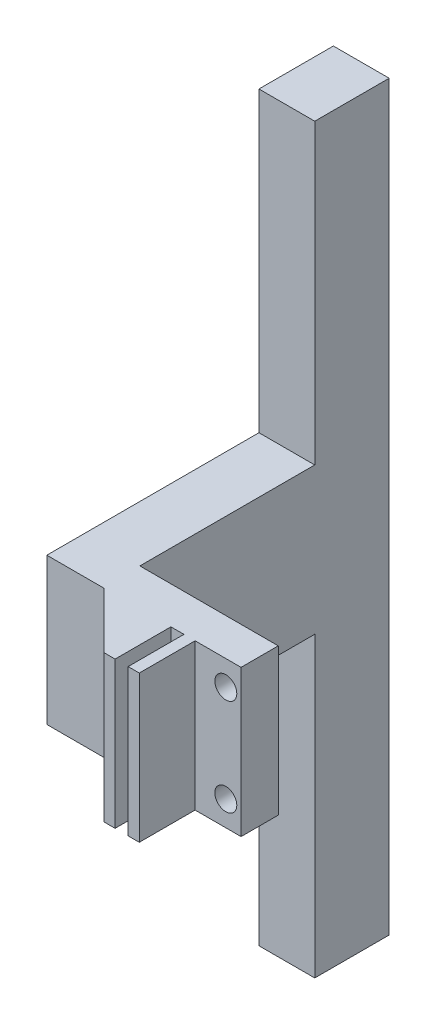
ISO-10303-21;
HEADER;
FILE_DESCRIPTION(('STEP AP214'),'2;1');
FILE_NAME('part.step','',(''),(''),'','','');
FILE_SCHEMA(('AUTOMOTIVE_DESIGN { 1 0 10303 214 1 1 1 1 }'));
ENDSEC;
DATA;
#1=APPLICATION_CONTEXT('core data for automotive mechanical design processes');
#2=APPLICATION_PROTOCOL_DEFINITION('international standard','automotive_design',2000,#1);
#3=PRODUCT_CONTEXT('',#1,'mechanical');
#4=PRODUCT('Part','Part','',(#3));
#5=PRODUCT_RELATED_PRODUCT_CATEGORY('part','',(#4));
#6=PRODUCT_DEFINITION_FORMATION('','',#4);
#7=PRODUCT_DEFINITION_CONTEXT('part definition',#1,'design');
#8=PRODUCT_DEFINITION('design','',#6,#7);
#9=PRODUCT_DEFINITION_SHAPE('','',#8);
#10=(LENGTH_UNIT() NAMED_UNIT(*) SI_UNIT(.MILLI.,.METRE.));
#11=(NAMED_UNIT(*) PLANE_ANGLE_UNIT() SI_UNIT($,.RADIAN.));
#12=(NAMED_UNIT(*) SI_UNIT($,.STERADIAN.) SOLID_ANGLE_UNIT());
#13=UNCERTAINTY_MEASURE_WITH_UNIT(LENGTH_MEASURE(1.E-05),#10,'distance_accuracy_value','');
#14=(GEOMETRIC_REPRESENTATION_CONTEXT(3) GLOBAL_UNCERTAINTY_ASSIGNED_CONTEXT((#13)) GLOBAL_UNIT_ASSIGNED_CONTEXT((#10,
#11,#12)) REPRESENTATION_CONTEXT('',''));
#15=CARTESIAN_POINT('',(0.,0.,0.));
#16=DIRECTION('',(0.,0.,1.));
#17=DIRECTION('',(1.,0.,0.));
#18=AXIS2_PLACEMENT_3D('',#15,#16,#17);
#19=CARTESIAN_POINT('',(0.,0.,10.));
#20=DIRECTION('',(0.,0.,1.));
#21=DIRECTION('',(1.,0.,0.));
#22=AXIS2_PLACEMENT_3D('',#19,#20,#21);
#23=PLANE('',#22);
#24=DIRECTION('',(1.,0.,0.));
#25=VECTOR('',#24,1.);
#26=CARTESIAN_POINT('',(0.,0.,10.));
#27=LINE('',#26,#25);
#28=CARTESIAN_POINT('',(-1.75000379152257,0.,10.));
#29=VERTEX_POINT('',#28);
#30=CARTESIAN_POINT('',(1.74999620847744,0.,10.));
#31=VERTEX_POINT('',#30);
#32=EDGE_CURVE('E297',#29,#31,#27,.T.);
#33=ORIENTED_EDGE('',*,*,#32,.F.);
#34=DIRECTION('',(0.,1.,0.));
#35=VECTOR('',#34,1.);
#36=CARTESIAN_POINT('',(-1.75000379152257,-39.4,10.));
#37=LINE('',#36,#35);
#38=CARTESIAN_POINT('',(-1.75000379152257,-39.4,10.));
#39=VERTEX_POINT('',#38);
#40=EDGE_CURVE('E233',#39,#29,#37,.T.);
#41=ORIENTED_EDGE('',*,*,#40,.F.);
#42=DIRECTION('',(-1.,0.,0.));
#43=VECTOR('',#42,1.);
#44=CARTESIAN_POINT('',(0.,-39.4,10.));
#45=LINE('',#44,#43);
#46=CARTESIAN_POINT('',(1.74999620847744,-39.4,10.));
#47=VERTEX_POINT('',#46);
#48=EDGE_CURVE('E290',#47,#39,#45,.T.);
#49=ORIENTED_EDGE('',*,*,#48,.F.);
#50=DIRECTION('',(0.,-1.,0.));
#51=VECTOR('',#50,1.);
#52=CARTESIAN_POINT('',(1.74999620847743,0.,10.));
#53=LINE('',#52,#51);
#54=EDGE_CURVE('E256',#31,#47,#53,.T.);
#55=ORIENTED_EDGE('',*,*,#54,.F.);
#56=EDGE_LOOP('',(#33,#41,#49,#55));
#57=FACE_BOUND('',#56,.T.);
#58=ADVANCED_FACE('F36',(#57),#23,.T.);
#59=CARTESIAN_POINT('',(-19.7500037915225,-39.4,10.));
#60=VERTEX_POINT('',#59);
#61=CARTESIAN_POINT('',(-35.098203500428,-39.4,10.));
#62=VERTEX_POINT('',#61);
#63=EDGE_CURVE('E285',#60,#62,#45,.T.);
#64=ORIENTED_EDGE('',*,*,#63,.F.);
#65=DIRECTION('',(0.,1.,0.));
#66=VECTOR('',#65,1.);
#67=CARTESIAN_POINT('',(-19.7500037915225,0.,10.));
#68=LINE('',#67,#66);
#69=CARTESIAN_POINT('',(-19.7500037915225,0.,10.));
#70=VERTEX_POINT('',#69);
#71=EDGE_CURVE('E54',#60,#70,#68,.T.);
#72=ORIENTED_EDGE('',*,*,#71,.T.);
#73=CARTESIAN_POINT('',(-35.098203500428,0.,10.));
#74=VERTEX_POINT('',#73);
#75=EDGE_CURVE('E294',#74,#70,#27,.T.);
#76=ORIENTED_EDGE('',*,*,#75,.F.);
#77=DIRECTION('',(0.,-1.,0.));
#78=VECTOR('',#77,1.);
#79=CARTESIAN_POINT('',(-35.098203500428,-39.4,10.));
#80=LINE('',#79,#78);
#81=EDGE_CURVE('E218',#74,#62,#80,.T.);
#82=ORIENTED_EDGE('',*,*,#81,.T.);
#83=EDGE_LOOP('',(#64,#72,#76,#82));
#84=FACE_BOUND('',#83,.T.);
#85=ADVANCED_FACE('F342',(#84),#23,.T.);
#86=CARTESIAN_POINT('',(0.,-39.4,10.));
#87=DIRECTION('',(0.,-1.,0.));
#88=DIRECTION('',(0.,0.,-1.));
#89=AXIS2_PLACEMENT_3D('',#86,#87,#88);
#90=PLANE('',#89);
#91=DIRECTION('',(-1.,0.,0.));
#92=VECTOR('',#91,1.);
#93=CARTESIAN_POINT('',(-35.098203500428,-39.4,-47.));
#94=LINE('',#93,#92);
#95=CARTESIAN_POINT('',(-20.098203500428,-39.4,-47.));
#96=VERTEX_POINT('',#95);
#97=CARTESIAN_POINT('',(-35.098203500428,-39.4,-47.));
#98=VERTEX_POINT('',#97);
#99=EDGE_CURVE('E189',#96,#98,#94,.T.);
#100=ORIENTED_EDGE('',*,*,#99,.F.);
#101=DIRECTION('',(0.,0.,1.));
#102=VECTOR('',#101,1.);
#103=CARTESIAN_POINT('',(-20.098203500428,-39.4,-67.));
#104=LINE('',#103,#102);
#105=CARTESIAN_POINT('',(-20.098203500428,-39.4,0.));
#106=VERTEX_POINT('',#105);
#107=EDGE_CURVE('E222',#96,#106,#104,.T.);
#108=ORIENTED_EDGE('',*,*,#107,.T.);
#109=DIRECTION('',(-1.,0.,0.));
#110=VECTOR('',#109,1.);
#111=CARTESIAN_POINT('',(0.,-39.4,0.));
#112=LINE('',#111,#110);
#113=CARTESIAN_POINT('',(17.0981959173828,-39.4,0.));
#114=VERTEX_POINT('',#113);
#115=EDGE_CURVE('E309',#114,#106,#112,.T.);
#116=ORIENTED_EDGE('',*,*,#115,.F.);
#117=DIRECTION('',(0.,0.,-1.));
#118=VECTOR('',#117,1.);
#119=CARTESIAN_POINT('',(17.0981959173828,-39.4,10.));
#120=LINE('',#119,#118);
#121=CARTESIAN_POINT('',(17.0981959173828,-39.4,10.));
#122=VERTEX_POINT('',#121);
#123=EDGE_CURVE('E320',#122,#114,#120,.T.);
#124=ORIENTED_EDGE('',*,*,#123,.F.);
#125=CARTESIAN_POINT('',(4.74999620847743,-39.4,10.));
#126=VERTEX_POINT('',#125);
#127=EDGE_CURVE('E286',#122,#126,#45,.T.);
#128=ORIENTED_EDGE('',*,*,#127,.T.);
#129=DIRECTION('',(0.,0.,-1.));
#130=VECTOR('',#129,1.);
#131=CARTESIAN_POINT('',(4.74999620847743,-39.4,25.));
#132=LINE('',#131,#130);
#133=CARTESIAN_POINT('',(4.74999620847743,-39.4,25.));
#134=VERTEX_POINT('',#133);
#135=EDGE_CURVE('E275',#134,#126,#132,.T.);
#136=ORIENTED_EDGE('',*,*,#135,.F.);
#137=DIRECTION('',(1.,0.,0.));
#138=VECTOR('',#137,1.);
#139=CARTESIAN_POINT('',(4.74999620847743,-39.4,25.));
#140=LINE('',#139,#138);
#141=CARTESIAN_POINT('',(1.74999620847744,-39.4,25.));
#142=VERTEX_POINT('',#141);
#143=EDGE_CURVE('E252',#142,#134,#140,.T.);
#144=ORIENTED_EDGE('',*,*,#143,.F.);
#145=DIRECTION('',(0.,0.,-1.));
#146=VECTOR('',#145,1.);
#147=CARTESIAN_POINT('',(1.74999620847744,-39.4,25.));
#148=LINE('',#147,#146);
#149=EDGE_CURVE('E262',#142,#47,#148,.T.);
#150=ORIENTED_EDGE('',*,*,#149,.T.);
#151=ORIENTED_EDGE('',*,*,#48,.T.);
#152=DIRECTION('',(0.,0.,-1.));
#153=VECTOR('',#152,1.);
#154=CARTESIAN_POINT('',(-1.75000379152257,-39.4,25.));
#155=LINE('',#154,#153);
#156=CARTESIAN_POINT('',(-1.75000379152257,-39.4,25.));
#157=VERTEX_POINT('',#156);
#158=EDGE_CURVE('E249',#157,#39,#155,.T.);
#159=ORIENTED_EDGE('',*,*,#158,.F.);
#160=DIRECTION('',(1.,0.,0.));
#161=VECTOR('',#160,1.);
#162=CARTESIAN_POINT('',(-1.75000379152257,-39.4,25.));
#163=LINE('',#162,#161);
#164=CARTESIAN_POINT('',(-4.75000379152257,-39.4,25.));
#165=VERTEX_POINT('',#164);
#166=EDGE_CURVE('E234',#165,#157,#163,.T.);
#167=ORIENTED_EDGE('',*,*,#166,.F.);
#168=DIRECTION('',(-0.707106781186546,0.,-0.707106781186549));
#169=VECTOR('',#168,1.);
#170=CARTESIAN_POINT('',(-4.75000379152257,-39.4,25.));
#171=LINE('',#170,#169);
#172=EDGE_CURVE('E46',#165,#60,#171,.T.);
#173=ORIENTED_EDGE('',*,*,#172,.T.);
#174=ORIENTED_EDGE('',*,*,#63,.T.);
#175=DIRECTION('',(0.,0.,1.));
#176=VECTOR('',#175,1.);
#177=CARTESIAN_POINT('',(-35.098203500428,-39.4,-67.));
#178=LINE('',#177,#176);
#179=EDGE_CURVE('E225',#98,#62,#178,.T.);
#180=ORIENTED_EDGE('',*,*,#179,.F.);
#181=EDGE_LOOP('',(#100,#108,#116,#124,#128,#136,#144,#150,#151,#159,#167,#173,#174,#180));
#182=FACE_BOUND('',#181,.T.);
#183=ADVANCED_FACE('F350',(#182),#90,.T.);
#184=CARTESIAN_POINT('',(17.0981959173828,0.,10.));
#185=DIRECTION('',(1.,0.,0.));
#186=DIRECTION('',(0.,1.,0.));
#187=AXIS2_PLACEMENT_3D('',#184,#185,#186);
#188=PLANE('',#187);
#189=DIRECTION('',(0.,-1.,0.));
#190=VECTOR('',#189,1.);
#191=CARTESIAN_POINT('',(17.0981959173828,0.,0.));
#192=LINE('',#191,#190);
#193=CARTESIAN_POINT('',(17.0981959173828,0.,0.));
#194=VERTEX_POINT('',#193);
#195=EDGE_CURVE('E312',#194,#114,#192,.T.);
#196=ORIENTED_EDGE('',*,*,#195,.F.);
#197=DIRECTION('',(0.,0.,-1.));
#198=VECTOR('',#197,1.);
#199=CARTESIAN_POINT('',(17.0981959173828,0.,10.));
#200=LINE('',#199,#198);
#201=CARTESIAN_POINT('',(17.0981959173828,0.,10.));
#202=VERTEX_POINT('',#201);
#203=EDGE_CURVE('E296',#202,#194,#200,.T.);
#204=ORIENTED_EDGE('',*,*,#203,.F.);
#205=DIRECTION('',(0.,-1.,0.));
#206=VECTOR('',#205,1.);
#207=CARTESIAN_POINT('',(17.0981959173828,0.,10.));
#208=LINE('',#207,#206);
#209=EDGE_CURVE('E289',#202,#122,#208,.T.);
#210=ORIENTED_EDGE('',*,*,#209,.T.);
#211=ORIENTED_EDGE('',*,*,#123,.T.);
#212=EDGE_LOOP('',(#196,#204,#210,#211));
#213=FACE_BOUND('',#212,.T.);
#214=ADVANCED_FACE('F394',(#213),#188,.T.);
#215=CARTESIAN_POINT('',(0.,0.,10.));
#216=DIRECTION('',(0.,1.,0.));
#217=DIRECTION('',(0.,0.,1.));
#218=AXIS2_PLACEMENT_3D('',#215,#216,#217);
#219=PLANE('',#218);
#220=DIRECTION('',(1.,0.,0.));
#221=VECTOR('',#220,1.);
#222=CARTESIAN_POINT('',(-20.098203500428,0.,-47.));
#223=LINE('',#222,#221);
#224=CARTESIAN_POINT('',(-35.098203500428,0.,-47.));
#225=VERTEX_POINT('',#224);
#226=CARTESIAN_POINT('',(-20.098203500428,0.,-47.));
#227=VERTEX_POINT('',#226);
#228=EDGE_CURVE('E201',#225,#227,#223,.T.);
#229=ORIENTED_EDGE('',*,*,#228,.F.);
#230=DIRECTION('',(0.,0.,1.));
#231=VECTOR('',#230,1.);
#232=CARTESIAN_POINT('',(-35.098203500428,0.,-67.));
#233=LINE('',#232,#231);
#234=EDGE_CURVE('E228',#225,#74,#233,.T.);
#235=ORIENTED_EDGE('',*,*,#234,.T.);
#236=ORIENTED_EDGE('',*,*,#75,.T.);
#237=DIRECTION('',(0.707106781186546,0.,0.707106781186549));
#238=VECTOR('',#237,1.);
#239=CARTESIAN_POINT('',(-4.75000379152257,0.,25.));
#240=LINE('',#239,#238);
#241=CARTESIAN_POINT('',(-4.75000379152257,0.,25.));
#242=VERTEX_POINT('',#241);
#243=EDGE_CURVE('E11',#70,#242,#240,.T.);
#244=ORIENTED_EDGE('',*,*,#243,.T.);
#245=DIRECTION('',(-1.,0.,0.));
#246=VECTOR('',#245,1.);
#247=CARTESIAN_POINT('',(-4.75000379152257,0.,25.));
#248=LINE('',#247,#246);
#249=CARTESIAN_POINT('',(-1.75000379152257,0.,25.));
#250=VERTEX_POINT('',#249);
#251=EDGE_CURVE('E239',#250,#242,#248,.T.);
#252=ORIENTED_EDGE('',*,*,#251,.F.);
#253=DIRECTION('',(0.,0.,-1.));
#254=VECTOR('',#253,1.);
#255=CARTESIAN_POINT('',(-1.75000379152257,0.,25.));
#256=LINE('',#255,#254);
#257=EDGE_CURVE('E245',#250,#29,#256,.T.);
#258=ORIENTED_EDGE('',*,*,#257,.T.);
#259=ORIENTED_EDGE('',*,*,#32,.T.);
#260=DIRECTION('',(0.,0.,-1.));
#261=VECTOR('',#260,1.);
#262=CARTESIAN_POINT('',(1.74999620847743,0.,25.));
#263=LINE('',#262,#261);
#264=CARTESIAN_POINT('',(1.74999620847743,0.,25.));
#265=VERTEX_POINT('',#264);
#266=EDGE_CURVE('E269',#265,#31,#263,.T.);
#267=ORIENTED_EDGE('',*,*,#266,.F.);
#268=DIRECTION('',(-1.,0.,0.));
#269=VECTOR('',#268,1.);
#270=CARTESIAN_POINT('',(1.74999620847743,0.,25.));
#271=LINE('',#270,#269);
#272=CARTESIAN_POINT('',(4.74999620847743,0.,25.));
#273=VERTEX_POINT('',#272);
#274=EDGE_CURVE('E258',#273,#265,#271,.T.);
#275=ORIENTED_EDGE('',*,*,#274,.F.);
#276=DIRECTION('',(0.,0.,-1.));
#277=VECTOR('',#276,1.);
#278=CARTESIAN_POINT('',(4.74999620847743,0.,25.));
#279=LINE('',#278,#277);
#280=CARTESIAN_POINT('',(4.74999620847743,0.,10.));
#281=VERTEX_POINT('',#280);
#282=EDGE_CURVE('E272',#273,#281,#279,.T.);
#283=ORIENTED_EDGE('',*,*,#282,.T.);
#284=EDGE_CURVE('E293',#281,#202,#27,.T.);
#285=ORIENTED_EDGE('',*,*,#284,.T.);
#286=ORIENTED_EDGE('',*,*,#203,.T.);
#287=DIRECTION('',(1.,0.,0.));
#288=VECTOR('',#287,1.);
#289=CARTESIAN_POINT('',(0.,0.,0.));
#290=LINE('',#289,#288);
#291=CARTESIAN_POINT('',(-20.098203500428,0.,0.));
#292=VERTEX_POINT('',#291);
#293=EDGE_CURVE('E315',#292,#194,#290,.T.);
#294=ORIENTED_EDGE('',*,*,#293,.F.);
#295=DIRECTION('',(0.,0.,1.));
#296=VECTOR('',#295,1.);
#297=CARTESIAN_POINT('',(-20.098203500428,0.,-67.));
#298=LINE('',#297,#296);
#299=EDGE_CURVE('E175',#227,#292,#298,.T.);
#300=ORIENTED_EDGE('',*,*,#299,.F.);
#301=EDGE_LOOP('',(#229,#235,#236,#244,#252,#258,#259,#267,#275,#283,#285,#286,#294,#300));
#302=FACE_BOUND('',#301,.T.);
#303=ADVANCED_FACE('F375',(#302),#219,.T.);
#304=CARTESIAN_POINT('',(12.9999999999664,-6.70000000000001,10.));
#305=DIRECTION('',(0.,0.,-1.));
#306=DIRECTION('',(-1.,0.,0.));
#307=AXIS2_PLACEMENT_3D('',#304,#305,#306);
#308=CYLINDRICAL_SURFACE('',#307,2.94999999997266);
#309=CARTESIAN_POINT('',(12.9999999999664,-6.70000000000001,10.));
#310=DIRECTION('',(0.,0.,1.));
#311=DIRECTION('',(1.,0.,0.));
#312=AXIS2_PLACEMENT_3D('',#309,#310,#311);
#313=CIRCLE('',#312,2.94999999997266);
#314=CARTESIAN_POINT('',(15.9499999999391,-6.70000000000001,10.));
#315=VERTEX_POINT('',#314);
#316=EDGE_CURVE('E282',#315,#315,#313,.T.);
#317=ORIENTED_EDGE('',*,*,#316,.T.);
#318=EDGE_LOOP('',(#317));
#319=FACE_BOUND('',#318,.T.);
#320=CARTESIAN_POINT('',(12.9999999999664,-6.70000000000001,0.));
#321=DIRECTION('',(0.,0.,1.));
#322=DIRECTION('',(1.,0.,0.));
#323=AXIS2_PLACEMENT_3D('',#320,#321,#322);
#324=CIRCLE('',#323,2.94999999997266);
#325=CARTESIAN_POINT('',(15.9499999999391,-6.70000000000001,0.));
#326=VERTEX_POINT('',#325);
#327=EDGE_CURVE('E306',#326,#326,#324,.T.);
#328=ORIENTED_EDGE('',*,*,#327,.F.);
#329=EDGE_LOOP('',(#328));
#330=FACE_BOUND('',#329,.T.);
#331=ADVANCED_FACE('F371',(#319,#330),#308,.F.);
#332=CARTESIAN_POINT('',(12.9999999999664,-32.7,10.));
#333=DIRECTION('',(0.,0.,-1.));
#334=DIRECTION('',(-1.,0.,0.));
#335=AXIS2_PLACEMENT_3D('',#332,#333,#334);
#336=CYLINDRICAL_SURFACE('',#335,2.94999999997267);
#337=CARTESIAN_POINT('',(12.9999999999664,-32.7,10.));
#338=DIRECTION('',(0.,0.,1.));
#339=DIRECTION('',(1.,0.,0.));
#340=AXIS2_PLACEMENT_3D('',#337,#338,#339);
#341=CIRCLE('',#340,2.94999999997267);
#342=CARTESIAN_POINT('',(15.9499999999391,-32.7,10.));
#343=VERTEX_POINT('',#342);
#344=EDGE_CURVE('E279',#343,#343,#341,.T.);
#345=ORIENTED_EDGE('',*,*,#344,.T.);
#346=EDGE_LOOP('',(#345));
#347=FACE_BOUND('',#346,.T.);
#348=CARTESIAN_POINT('',(12.9999999999664,-32.7,0.));
#349=DIRECTION('',(0.,0.,1.));
#350=DIRECTION('',(1.,0.,0.));
#351=AXIS2_PLACEMENT_3D('',#348,#349,#350);
#352=CIRCLE('',#351,2.94999999997267);
#353=CARTESIAN_POINT('',(15.9499999999391,-32.7,0.));
#354=VERTEX_POINT('',#353);
#355=EDGE_CURVE('E303',#354,#354,#352,.T.);
#356=ORIENTED_EDGE('',*,*,#355,.F.);
#357=EDGE_LOOP('',(#356));
#358=FACE_BOUND('',#357,.T.);
#359=ADVANCED_FACE('F374',(#347,#358),#336,.F.);
#360=CARTESIAN_POINT('',(-13.0000000000336,-32.7,10.));
#361=DIRECTION('',(0.,0.,-1.));
#362=DIRECTION('',(-1.,0.,0.));
#363=AXIS2_PLACEMENT_3D('',#360,#361,#362);
#364=CYLINDRICAL_SURFACE('',#363,2.94999999999999);
#365=CARTESIAN_POINT('',(-13.0000000000336,-32.7,16.750003791489));
#366=DIRECTION('',(0.707106781186549,0.,-0.707106781186546));
#367=DIRECTION('',(-0.707106781186546,0.,-0.707106781186549));
#368=AXIS2_PLACEMENT_3D('',#365,#366,#367);
#369=ELLIPSE('',#368,4.17193000900063,2.94999999999999);
#370=CARTESIAN_POINT('',(-15.9500000000335,-32.7,13.800003791489));
#371=VERTEX_POINT('',#370);
#372=EDGE_CURVE('E41',#371,#371,#369,.F.);
#373=ORIENTED_EDGE('',*,*,#372,.T.);
#374=EDGE_LOOP('',(#373));
#375=FACE_BOUND('',#374,.T.);
#376=CARTESIAN_POINT('',(-13.0000000000336,-32.7,0.));
#377=DIRECTION('',(0.,0.,1.));
#378=DIRECTION('',(1.,0.,0.));
#379=AXIS2_PLACEMENT_3D('',#376,#377,#378);
#380=CIRCLE('',#379,2.94999999999999);
#381=CARTESIAN_POINT('',(-10.0500000000336,-32.7,0.));
#382=VERTEX_POINT('',#381);
#383=EDGE_CURVE('E300',#382,#382,#380,.T.);
#384=ORIENTED_EDGE('',*,*,#383,.F.);
#385=EDGE_LOOP('',(#384));
#386=FACE_BOUND('',#385,.T.);
#387=ADVANCED_FACE('F329',(#375,#386),#364,.F.);
#388=CARTESIAN_POINT('',(-13.0000000000336,-6.70000000000001,10.));
#389=DIRECTION('',(0.,0.,-1.));
#390=DIRECTION('',(-1.,0.,0.));
#391=AXIS2_PLACEMENT_3D('',#388,#389,#390);
#392=CYLINDRICAL_SURFACE('',#391,2.95);
#393=CARTESIAN_POINT('',(-13.0000000000336,-6.70000000000001,16.750003791489));
#394=DIRECTION('',(0.707106781186549,0.,-0.707106781186546));
#395=DIRECTION('',(-0.707106781186546,0.,-0.707106781186549));
#396=AXIS2_PLACEMENT_3D('',#393,#394,#395);
#397=ELLIPSE('',#396,4.17193000900063,2.95);
#398=CARTESIAN_POINT('',(-15.9500000000335,-6.70000000000001,13.800003791489));
#399=VERTEX_POINT('',#398);
#400=EDGE_CURVE('E318',#399,#399,#397,.F.);
#401=ORIENTED_EDGE('',*,*,#400,.T.);
#402=EDGE_LOOP('',(#401));
#403=FACE_BOUND('',#402,.T.);
#404=CARTESIAN_POINT('',(-13.0000000000336,-6.70000000000001,0.));
#405=DIRECTION('',(0.,0.,1.));
#406=DIRECTION('',(1.,0.,0.));
#407=AXIS2_PLACEMENT_3D('',#404,#405,#406);
#408=CIRCLE('',#407,2.95);
#409=CARTESIAN_POINT('',(-10.0500000000336,-6.70000000000001,0.));
#410=VERTEX_POINT('',#409);
#411=EDGE_CURVE('E278',#410,#410,#408,.T.);
#412=ORIENTED_EDGE('',*,*,#411,.F.);
#413=EDGE_LOOP('',(#412));
#414=FACE_BOUND('',#413,.T.);
#415=ADVANCED_FACE('F356',(#403,#414),#392,.F.);
#416=DIRECTION('',(0.,1.,0.));
#417=VECTOR('',#416,1.);
#418=CARTESIAN_POINT('',(4.74999620847743,0.,10.));
#419=LINE('',#418,#417);
#420=EDGE_CURVE('E251',#126,#281,#419,.T.);
#421=ORIENTED_EDGE('',*,*,#420,.F.);
#422=ORIENTED_EDGE('',*,*,#127,.F.);
#423=ORIENTED_EDGE('',*,*,#209,.F.);
#424=ORIENTED_EDGE('',*,*,#284,.F.);
#425=EDGE_LOOP('',(#421,#422,#423,#424));
#426=FACE_BOUND('',#425,.T.);
#427=ORIENTED_EDGE('',*,*,#344,.F.);
#428=EDGE_LOOP('',(#427));
#429=FACE_BOUND('',#428,.T.);
#430=ORIENTED_EDGE('',*,*,#316,.F.);
#431=EDGE_LOOP('',(#430));
#432=FACE_BOUND('',#431,.T.);
#433=ADVANCED_FACE('F345',(#426,#429,#432),#23,.T.);
#434=CARTESIAN_POINT('',(0.,0.,0.));
#435=DIRECTION('',(0.,0.,1.));
#436=DIRECTION('',(1.,0.,0.));
#437=AXIS2_PLACEMENT_3D('',#434,#435,#436);
#438=PLANE('',#437);
#439=ORIENTED_EDGE('',*,*,#411,.T.);
#440=EDGE_LOOP('',(#439));
#441=FACE_BOUND('',#440,.T.);
#442=ORIENTED_EDGE('',*,*,#383,.T.);
#443=EDGE_LOOP('',(#442));
#444=FACE_BOUND('',#443,.T.);
#445=ORIENTED_EDGE('',*,*,#355,.T.);
#446=EDGE_LOOP('',(#445));
#447=FACE_BOUND('',#446,.T.);
#448=ORIENTED_EDGE('',*,*,#327,.T.);
#449=EDGE_LOOP('',(#448));
#450=FACE_BOUND('',#449,.T.);
#451=ORIENTED_EDGE('',*,*,#115,.T.);
#452=DIRECTION('',(0.,1.,0.));
#453=VECTOR('',#452,1.);
#454=CARTESIAN_POINT('',(-20.098203500428,0.,0.));
#455=LINE('',#454,#453);
#456=EDGE_CURVE('E224',#106,#292,#455,.T.);
#457=ORIENTED_EDGE('',*,*,#456,.T.);
#458=ORIENTED_EDGE('',*,*,#293,.T.);
#459=ORIENTED_EDGE('',*,*,#195,.T.);
#460=EDGE_LOOP('',(#451,#457,#458,#459));
#461=FACE_BOUND('',#460,.T.);
#462=ADVANCED_FACE('F355',(#441,#444,#447,#450,#461),#438,.F.);
#463=CARTESIAN_POINT('',(4.74999620847743,0.,25.));
#464=DIRECTION('',(-1.,0.,0.));
#465=DIRECTION('',(0.,-1.,0.));
#466=AXIS2_PLACEMENT_3D('',#463,#464,#465);
#467=PLANE('',#466);
#468=ORIENTED_EDGE('',*,*,#420,.T.);
#469=ORIENTED_EDGE('',*,*,#282,.F.);
#470=DIRECTION('',(0.,1.,0.));
#471=VECTOR('',#470,1.);
#472=CARTESIAN_POINT('',(4.74999620847743,0.,25.));
#473=LINE('',#472,#471);
#474=EDGE_CURVE('E255',#134,#273,#473,.T.);
#475=ORIENTED_EDGE('',*,*,#474,.F.);
#476=ORIENTED_EDGE('',*,*,#135,.T.);
#477=EDGE_LOOP('',(#468,#469,#475,#476));
#478=FACE_BOUND('',#477,.T.);
#479=ADVANCED_FACE('F362',(#478),#467,.F.);
#480=CARTESIAN_POINT('',(1.74999620847743,0.,25.));
#481=DIRECTION('',(1.,0.,0.));
#482=DIRECTION('',(0.,1.,0.));
#483=AXIS2_PLACEMENT_3D('',#480,#481,#482);
#484=PLANE('',#483);
#485=ORIENTED_EDGE('',*,*,#54,.T.);
#486=ORIENTED_EDGE('',*,*,#149,.F.);
#487=DIRECTION('',(0.,-1.,0.));
#488=VECTOR('',#487,1.);
#489=CARTESIAN_POINT('',(1.74999620847743,0.,25.));
#490=LINE('',#489,#488);
#491=EDGE_CURVE('E260',#265,#142,#490,.T.);
#492=ORIENTED_EDGE('',*,*,#491,.F.);
#493=ORIENTED_EDGE('',*,*,#266,.T.);
#494=EDGE_LOOP('',(#485,#486,#492,#493));
#495=FACE_BOUND('',#494,.T.);
#496=ADVANCED_FACE('F407',(#495),#484,.F.);
#497=CARTESIAN_POINT('',(0.,0.,25.));
#498=DIRECTION('',(0.,0.,1.));
#499=DIRECTION('',(1.,0.,0.));
#500=AXIS2_PLACEMENT_3D('',#497,#498,#499);
#501=PLANE('',#500);
#502=ORIENTED_EDGE('',*,*,#143,.T.);
#503=ORIENTED_EDGE('',*,*,#474,.T.);
#504=ORIENTED_EDGE('',*,*,#274,.T.);
#505=ORIENTED_EDGE('',*,*,#491,.T.);
#506=EDGE_LOOP('',(#502,#503,#504,#505));
#507=FACE_BOUND('',#506,.T.);
#508=ADVANCED_FACE('F401',(#507),#501,.T.);
#509=CARTESIAN_POINT('',(-1.75000379152257,-39.4,25.));
#510=DIRECTION('',(-1.,0.,0.));
#511=DIRECTION('',(0.,0.,1.));
#512=AXIS2_PLACEMENT_3D('',#509,#510,#511);
#513=PLANE('',#512);
#514=ORIENTED_EDGE('',*,*,#40,.T.);
#515=ORIENTED_EDGE('',*,*,#257,.F.);
#516=DIRECTION('',(0.,1.,0.));
#517=VECTOR('',#516,1.);
#518=CARTESIAN_POINT('',(-1.75000379152257,-39.4,25.));
#519=LINE('',#518,#517);
#520=EDGE_CURVE('E237',#157,#250,#519,.T.);
#521=ORIENTED_EDGE('',*,*,#520,.F.);
#522=ORIENTED_EDGE('',*,*,#158,.T.);
#523=EDGE_LOOP('',(#514,#515,#521,#522));
#524=FACE_BOUND('',#523,.T.);
#525=ADVANCED_FACE('F417',(#524),#513,.F.);
#526=CARTESIAN_POINT('',(0.,0.,25.));
#527=DIRECTION('',(0.,0.,-1.));
#528=DIRECTION('',(-1.,0.,0.));
#529=AXIS2_PLACEMENT_3D('',#526,#527,#528);
#530=PLANE('',#529);
#531=ORIENTED_EDGE('',*,*,#166,.T.);
#532=ORIENTED_EDGE('',*,*,#520,.T.);
#533=ORIENTED_EDGE('',*,*,#251,.T.);
#534=DIRECTION('',(0.,-1.,0.));
#535=VECTOR('',#534,1.);
#536=CARTESIAN_POINT('',(-4.75000379152257,-39.4,25.));
#537=LINE('',#536,#535);
#538=EDGE_CURVE('E242',#242,#165,#537,.T.);
#539=ORIENTED_EDGE('',*,*,#538,.T.);
#540=EDGE_LOOP('',(#531,#532,#533,#539));
#541=FACE_BOUND('',#540,.T.);
#542=ADVANCED_FACE('F415',(#541),#530,.F.);
#543=CARTESIAN_POINT('',(-20.098203500428,-39.4,-67.));
#544=DIRECTION('',(1.,0.,0.));
#545=DIRECTION('',(0.,0.,-1.));
#546=AXIS2_PLACEMENT_3D('',#543,#544,#545);
#547=PLANE('',#546);
#548=ORIENTED_EDGE('',*,*,#456,.F.);
#549=ORIENTED_EDGE('',*,*,#107,.F.);
#550=DIRECTION('',(0.,1.,0.));
#551=VECTOR('',#550,1.);
#552=CARTESIAN_POINT('',(-20.098203500428,-119.4,-47.));
#553=LINE('',#552,#551);
#554=CARTESIAN_POINT('',(-20.098203500428,-119.4,-47.));
#555=VERTEX_POINT('',#554);
#556=EDGE_CURVE('E198',#555,#96,#553,.T.);
#557=ORIENTED_EDGE('',*,*,#556,.F.);
#558=DIRECTION('',(0.,0.,1.));
#559=VECTOR('',#558,1.);
#560=CARTESIAN_POINT('',(-20.098203500428,-119.4,-67.));
#561=LINE('',#560,#559);
#562=CARTESIAN_POINT('',(-20.098203500428,-119.4,-67.));
#563=VERTEX_POINT('',#562);
#564=EDGE_CURVE('E183',#563,#555,#561,.T.);
#565=ORIENTED_EDGE('',*,*,#564,.F.);
#566=DIRECTION('',(0.,1.,0.));
#567=VECTOR('',#566,1.);
#568=CARTESIAN_POINT('',(-20.098203500428,-39.4,-67.));
#569=LINE('',#568,#567);
#570=CARTESIAN_POINT('',(-20.098203500428,80.,-67.));
#571=VERTEX_POINT('',#570);
#572=EDGE_CURVE('E176',#563,#571,#569,.T.);
#573=ORIENTED_EDGE('',*,*,#572,.T.);
#574=DIRECTION('',(0.,0.,-1.));
#575=VECTOR('',#574,1.);
#576=CARTESIAN_POINT('',(-20.098203500428,80.,-67.));
#577=LINE('',#576,#575);
#578=CARTESIAN_POINT('',(-20.098203500428,80.,-47.));
#579=VERTEX_POINT('',#578);
#580=EDGE_CURVE('E202',#579,#571,#577,.T.);
#581=ORIENTED_EDGE('',*,*,#580,.F.);
#582=DIRECTION('',(0.,-1.,0.));
#583=VECTOR('',#582,1.);
#584=CARTESIAN_POINT('',(-20.098203500428,80.,-47.));
#585=LINE('',#584,#583);
#586=EDGE_CURVE('E210',#579,#227,#585,.T.);
#587=ORIENTED_EDGE('',*,*,#586,.T.);
#588=ORIENTED_EDGE('',*,*,#299,.T.);
#589=EDGE_LOOP('',(#548,#549,#557,#565,#573,#581,#587,#588));
#590=FACE_BOUND('',#589,.T.);
#591=ADVANCED_FACE('F386',(#590),#547,.T.);
#592=CARTESIAN_POINT('',(-35.098203500428,-39.4,-67.));
#593=DIRECTION('',(-1.,0.,0.));
#594=DIRECTION('',(0.,0.,1.));
#595=AXIS2_PLACEMENT_3D('',#592,#593,#594);
#596=PLANE('',#595);
#597=ORIENTED_EDGE('',*,*,#81,.F.);
#598=ORIENTED_EDGE('',*,*,#234,.F.);
#599=DIRECTION('',(0.,-1.,0.));
#600=VECTOR('',#599,1.);
#601=CARTESIAN_POINT('',(-35.098203500428,80.,-47.));
#602=LINE('',#601,#600);
#603=CARTESIAN_POINT('',(-35.098203500428,80.,-47.));
#604=VERTEX_POINT('',#603);
#605=EDGE_CURVE('E215',#604,#225,#602,.T.);
#606=ORIENTED_EDGE('',*,*,#605,.F.);
#607=DIRECTION('',(0.,0.,1.));
#608=VECTOR('',#607,1.);
#609=CARTESIAN_POINT('',(-35.098203500428,80.,-67.));
#610=LINE('',#609,#608);
#611=CARTESIAN_POINT('',(-35.098203500428,80.,-67.));
#612=VERTEX_POINT('',#611);
#613=EDGE_CURVE('E171',#612,#604,#610,.T.);
#614=ORIENTED_EDGE('',*,*,#613,.F.);
#615=DIRECTION('',(0.,-1.,0.));
#616=VECTOR('',#615,1.);
#617=CARTESIAN_POINT('',(-35.098203500428,-39.4,-67.));
#618=LINE('',#617,#616);
#619=CARTESIAN_POINT('',(-35.098203500428,-119.4,-67.));
#620=VERTEX_POINT('',#619);
#621=EDGE_CURVE('E163',#612,#620,#618,.T.);
#622=ORIENTED_EDGE('',*,*,#621,.T.);
#623=DIRECTION('',(0.,0.,-1.));
#624=VECTOR('',#623,1.);
#625=CARTESIAN_POINT('',(-35.098203500428,-119.4,-47.));
#626=LINE('',#625,#624);
#627=CARTESIAN_POINT('',(-35.098203500428,-119.4,-47.));
#628=VERTEX_POINT('',#627);
#629=EDGE_CURVE('E169',#628,#620,#626,.T.);
#630=ORIENTED_EDGE('',*,*,#629,.F.);
#631=DIRECTION('',(0.,1.,0.));
#632=VECTOR('',#631,1.);
#633=CARTESIAN_POINT('',(-35.098203500428,-119.4,-47.));
#634=LINE('',#633,#632);
#635=EDGE_CURVE('E195',#628,#98,#634,.T.);
#636=ORIENTED_EDGE('',*,*,#635,.T.);
#637=ORIENTED_EDGE('',*,*,#179,.T.);
#638=EDGE_LOOP('',(#597,#598,#606,#614,#622,#630,#636,#637));
#639=FACE_BOUND('',#638,.T.);
#640=ADVANCED_FACE('F166',(#639),#596,.T.);
#641=CARTESIAN_POINT('',(0.,0.,-67.));
#642=DIRECTION('',(0.,0.,1.));
#643=DIRECTION('',(1.,0.,0.));
#644=AXIS2_PLACEMENT_3D('',#641,#642,#643);
#645=PLANE('',#644);
#646=ORIENTED_EDGE('',*,*,#572,.F.);
#647=DIRECTION('',(1.,0.,0.));
#648=VECTOR('',#647,1.);
#649=CARTESIAN_POINT('',(-35.098203500428,-119.4,-67.));
#650=LINE('',#649,#648);
#651=EDGE_CURVE('E179',#620,#563,#650,.T.);
#652=ORIENTED_EDGE('',*,*,#651,.F.);
#653=ORIENTED_EDGE('',*,*,#621,.F.);
#654=DIRECTION('',(-1.,0.,0.));
#655=VECTOR('',#654,1.);
#656=CARTESIAN_POINT('',(-20.098203500428,80.,-67.));
#657=LINE('',#656,#655);
#658=EDGE_CURVE('E205',#571,#612,#657,.T.);
#659=ORIENTED_EDGE('',*,*,#658,.F.);
#660=EDGE_LOOP('',(#646,#652,#653,#659));
#661=FACE_BOUND('',#660,.T.);
#662=ADVANCED_FACE('F180',(#661),#645,.F.);
#663=CARTESIAN_POINT('',(-20.098203500428,80.,-47.));
#664=DIRECTION('',(0.,0.,-1.));
#665=DIRECTION('',(-1.,0.,0.));
#666=AXIS2_PLACEMENT_3D('',#663,#664,#665);
#667=PLANE('',#666);
#668=ORIENTED_EDGE('',*,*,#228,.T.);
#669=ORIENTED_EDGE('',*,*,#586,.F.);
#670=DIRECTION('',(1.,0.,0.));
#671=VECTOR('',#670,1.);
#672=CARTESIAN_POINT('',(-20.098203500428,80.,-47.));
#673=LINE('',#672,#671);
#674=EDGE_CURVE('E208',#604,#579,#673,.T.);
#675=ORIENTED_EDGE('',*,*,#674,.F.);
#676=ORIENTED_EDGE('',*,*,#605,.T.);
#677=EDGE_LOOP('',(#668,#669,#675,#676));
#678=FACE_BOUND('',#677,.T.);
#679=ADVANCED_FACE('F461',(#678),#667,.F.);
#680=CARTESIAN_POINT('',(0.,80.,0.));
#681=DIRECTION('',(0.,-1.,0.));
#682=DIRECTION('',(1.,0.,0.));
#683=AXIS2_PLACEMENT_3D('',#680,#681,#682);
#684=PLANE('',#683);
#685=ORIENTED_EDGE('',*,*,#580,.T.);
#686=ORIENTED_EDGE('',*,*,#658,.T.);
#687=ORIENTED_EDGE('',*,*,#613,.T.);
#688=ORIENTED_EDGE('',*,*,#674,.T.);
#689=EDGE_LOOP('',(#685,#686,#687,#688));
#690=FACE_BOUND('',#689,.T.);
#691=ADVANCED_FACE('F466',(#690),#684,.F.);
#692=CARTESIAN_POINT('',(-35.098203500428,-119.4,-47.));
#693=DIRECTION('',(0.,0.,-1.));
#694=DIRECTION('',(-1.,0.,0.));
#695=AXIS2_PLACEMENT_3D('',#692,#693,#694);
#696=PLANE('',#695);
#697=ORIENTED_EDGE('',*,*,#99,.T.);
#698=ORIENTED_EDGE('',*,*,#635,.F.);
#699=DIRECTION('',(-1.,0.,0.));
#700=VECTOR('',#699,1.);
#701=CARTESIAN_POINT('',(-35.098203500428,-119.4,-47.));
#702=LINE('',#701,#700);
#703=EDGE_CURVE('E187',#555,#628,#702,.T.);
#704=ORIENTED_EDGE('',*,*,#703,.F.);
#705=ORIENTED_EDGE('',*,*,#556,.T.);
#706=EDGE_LOOP('',(#697,#698,#704,#705));
#707=FACE_BOUND('',#706,.T.);
#708=ADVANCED_FACE('F337',(#707),#696,.F.);
#709=CARTESIAN_POINT('',(0.,-119.4,0.));
#710=DIRECTION('',(0.,-1.,0.));
#711=DIRECTION('',(0.,0.,-1.));
#712=AXIS2_PLACEMENT_3D('',#709,#710,#711);
#713=PLANE('',#712);
#714=ORIENTED_EDGE('',*,*,#629,.T.);
#715=ORIENTED_EDGE('',*,*,#651,.T.);
#716=ORIENTED_EDGE('',*,*,#564,.T.);
#717=ORIENTED_EDGE('',*,*,#703,.T.);
#718=EDGE_LOOP('',(#714,#715,#716,#717));
#719=FACE_BOUND('',#718,.T.);
#720=ADVANCED_FACE('F185',(#719),#713,.T.);
#721=CARTESIAN_POINT('',(-4.75000379152257,-39.4,25.));
#722=DIRECTION('',(0.707106781186549,0.,-0.707106781186546));
#723=DIRECTION('',(0.,-1.,0.));
#724=AXIS2_PLACEMENT_3D('',#721,#722,#723);
#725=PLANE('',#724);
#726=ORIENTED_EDGE('',*,*,#243,.F.);
#727=ORIENTED_EDGE('',*,*,#71,.F.);
#728=ORIENTED_EDGE('',*,*,#172,.F.);
#729=ORIENTED_EDGE('',*,*,#538,.F.);
#730=EDGE_LOOP('',(#726,#727,#728,#729));
#731=FACE_BOUND('',#730,.T.);
#732=ORIENTED_EDGE('',*,*,#400,.F.);
#733=EDGE_LOOP('',(#732));
#734=FACE_BOUND('',#733,.T.);
#735=ORIENTED_EDGE('',*,*,#372,.F.);
#736=EDGE_LOOP('',(#735));
#737=FACE_BOUND('',#736,.T.);
#738=ADVANCED_FACE('F39',(#731,#734,#737),#725,.F.);
#739=CLOSED_SHELL('',(#58,#85,#183,#214,#303,#331,#359,#387,#415,#433,#462,#479,#496,#508,#525,
#542,#591,#640,#662,#679,#691,#708,#720,#738));
#740=MANIFOLD_SOLID_BREP('B2',#739);
#741=ADVANCED_BREP_SHAPE_REPRESENTATION('',(#18,#740),#14);
#742=SHAPE_DEFINITION_REPRESENTATION(#9,#741);
ENDSEC;
END-ISO-10303-21;
